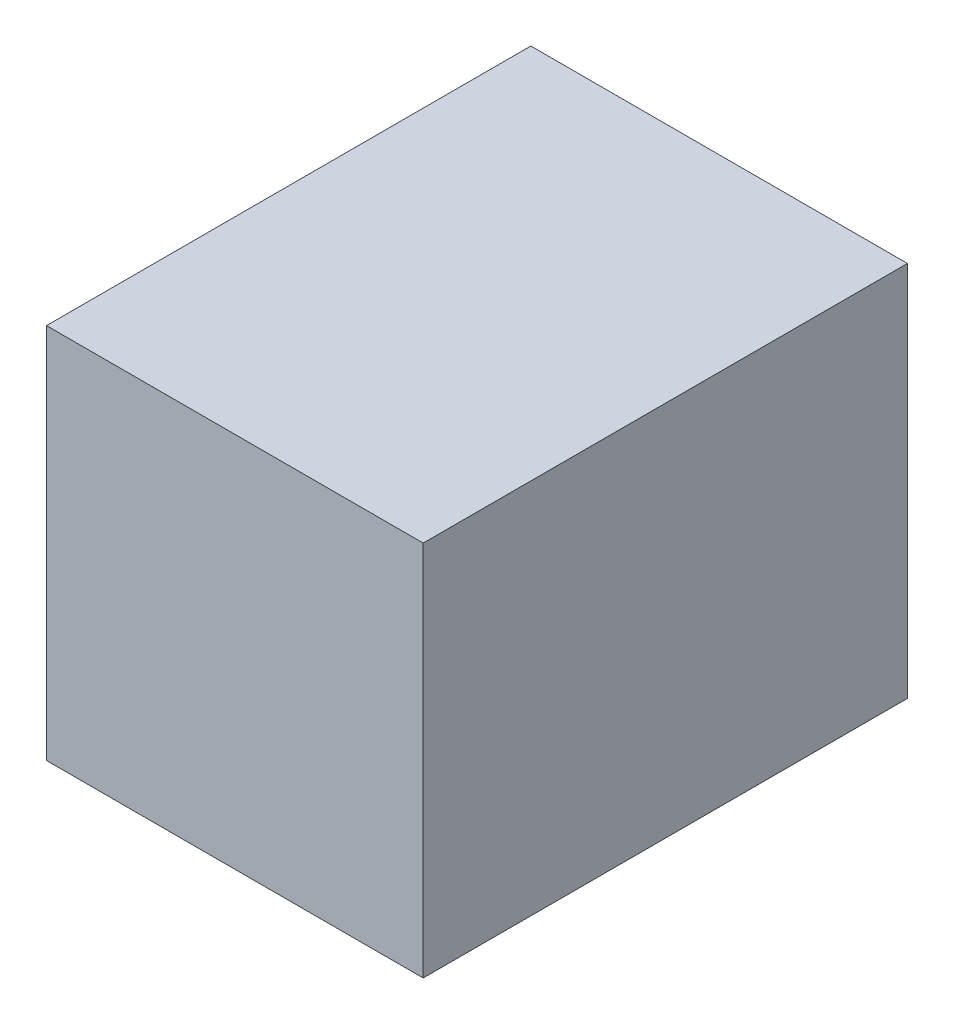
ISO-10303-21;
HEADER;
FILE_DESCRIPTION(('STEP AP214'),'2;1');
FILE_NAME('part.step','',(''),(''),'','','');
FILE_SCHEMA(('AUTOMOTIVE_DESIGN { 1 0 10303 214 1 1 1 1 }'));
ENDSEC;
DATA;
#1=APPLICATION_CONTEXT('core data for automotive mechanical design processes');
#2=APPLICATION_PROTOCOL_DEFINITION('international standard','automotive_design',2000,#1);
#3=PRODUCT_CONTEXT('',#1,'mechanical');
#4=PRODUCT('Part','Part','',(#3));
#5=PRODUCT_RELATED_PRODUCT_CATEGORY('part','',(#4));
#6=PRODUCT_DEFINITION_FORMATION('','',#4);
#7=PRODUCT_DEFINITION_CONTEXT('part definition',#1,'design');
#8=PRODUCT_DEFINITION('design','',#6,#7);
#9=PRODUCT_DEFINITION_SHAPE('','',#8);
#10=(LENGTH_UNIT() NAMED_UNIT(*) SI_UNIT(.MILLI.,.METRE.));
#11=(NAMED_UNIT(*) PLANE_ANGLE_UNIT() SI_UNIT($,.RADIAN.));
#12=(NAMED_UNIT(*) SI_UNIT($,.STERADIAN.) SOLID_ANGLE_UNIT());
#13=UNCERTAINTY_MEASURE_WITH_UNIT(LENGTH_MEASURE(1.E-05),#10,'distance_accuracy_value','');
#14=(GEOMETRIC_REPRESENTATION_CONTEXT(3) GLOBAL_UNCERTAINTY_ASSIGNED_CONTEXT((#13)) GLOBAL_UNIT_ASSIGNED_CONTEXT((#10,
#11,#12)) REPRESENTATION_CONTEXT('',''));
#15=CARTESIAN_POINT('',(0.,0.,0.));
#16=DIRECTION('',(0.,0.,1.));
#17=DIRECTION('',(1.,0.,0.));
#18=AXIS2_PLACEMENT_3D('',#15,#16,#17);
#19=CARTESIAN_POINT('',(0.,0.,450.));
#20=DIRECTION('',(1.,0.,0.));
#21=DIRECTION('',(0.,0.,-1.));
#22=AXIS2_PLACEMENT_3D('',#19,#20,#21);
#23=PLANE('',#22);
#24=DIRECTION('',(0.,-1.,0.));
#25=VECTOR('',#24,1.);
#26=CARTESIAN_POINT('',(0.,0.,0.));
#27=LINE('',#26,#25);
#28=CARTESIAN_POINT('',(0.,350.,0.));
#29=VERTEX_POINT('',#28);
#30=CARTESIAN_POINT('',(0.,0.,0.));
#31=VERTEX_POINT('',#30);
#32=EDGE_CURVE('E96',#29,#31,#27,.T.);
#33=ORIENTED_EDGE('',*,*,#32,.T.);
#34=DIRECTION('',(0.,0.,-1.));
#35=VECTOR('',#34,1.);
#36=CARTESIAN_POINT('',(0.,0.,450.));
#37=LINE('',#36,#35);
#38=CARTESIAN_POINT('',(0.,0.,450.));
#39=VERTEX_POINT('',#38);
#40=EDGE_CURVE('E11',#39,#31,#37,.T.);
#41=ORIENTED_EDGE('',*,*,#40,.F.);
#42=DIRECTION('',(0.,-1.,0.));
#43=VECTOR('',#42,1.);
#44=CARTESIAN_POINT('',(0.,0.,450.));
#45=LINE('',#44,#43);
#46=CARTESIAN_POINT('',(0.,350.,450.));
#47=VERTEX_POINT('',#46);
#48=EDGE_CURVE('E84',#47,#39,#45,.T.);
#49=ORIENTED_EDGE('',*,*,#48,.F.);
#50=DIRECTION('',(0.,0.,-1.));
#51=VECTOR('',#50,1.);
#52=CARTESIAN_POINT('',(0.,350.,450.));
#53=LINE('',#52,#51);
#54=EDGE_CURVE('E92',#47,#29,#53,.T.);
#55=ORIENTED_EDGE('',*,*,#54,.T.);
#56=EDGE_LOOP('',(#33,#41,#49,#55));
#57=FACE_BOUND('',#56,.T.);
#58=ADVANCED_FACE('F33',(#57),#23,.F.);
#59=CARTESIAN_POINT('',(0.,0.,450.));
#60=DIRECTION('',(0.,1.,0.));
#61=DIRECTION('',(0.,0.,1.));
#62=AXIS2_PLACEMENT_3D('',#59,#60,#61);
#63=PLANE('',#62);
#64=DIRECTION('',(1.,0.,0.));
#65=VECTOR('',#64,1.);
#66=CARTESIAN_POINT('',(0.,0.,0.));
#67=LINE('',#66,#65);
#68=CARTESIAN_POINT('',(350.,0.,0.));
#69=VERTEX_POINT('',#68);
#70=EDGE_CURVE('E88',#31,#69,#67,.T.);
#71=ORIENTED_EDGE('',*,*,#70,.T.);
#72=DIRECTION('',(0.,0.,-1.));
#73=VECTOR('',#72,1.);
#74=CARTESIAN_POINT('',(350.,0.,450.));
#75=LINE('',#74,#73);
#76=CARTESIAN_POINT('',(350.,0.,450.));
#77=VERTEX_POINT('',#76);
#78=EDGE_CURVE('E41',#77,#69,#75,.T.);
#79=ORIENTED_EDGE('',*,*,#78,.F.);
#80=DIRECTION('',(1.,0.,0.));
#81=VECTOR('',#80,1.);
#82=CARTESIAN_POINT('',(0.,0.,450.));
#83=LINE('',#82,#81);
#84=EDGE_CURVE('E79',#39,#77,#83,.T.);
#85=ORIENTED_EDGE('',*,*,#84,.F.);
#86=ORIENTED_EDGE('',*,*,#40,.T.);
#87=EDGE_LOOP('',(#71,#79,#85,#86));
#88=FACE_BOUND('',#87,.T.);
#89=ADVANCED_FACE('F87',(#88),#63,.F.);
#90=CARTESIAN_POINT('',(350.,0.,450.));
#91=DIRECTION('',(-1.,0.,0.));
#92=DIRECTION('',(0.,0.,1.));
#93=AXIS2_PLACEMENT_3D('',#90,#91,#92);
#94=PLANE('',#93);
#95=DIRECTION('',(0.,1.,0.));
#96=VECTOR('',#95,1.);
#97=CARTESIAN_POINT('',(350.,0.,0.));
#98=LINE('',#97,#96);
#99=CARTESIAN_POINT('',(350.,350.,0.));
#100=VERTEX_POINT('',#99);
#101=EDGE_CURVE('E66',#69,#100,#98,.T.);
#102=ORIENTED_EDGE('',*,*,#101,.T.);
#103=DIRECTION('',(0.,0.,-1.));
#104=VECTOR('',#103,1.);
#105=CARTESIAN_POINT('',(350.,350.,450.));
#106=LINE('',#105,#104);
#107=CARTESIAN_POINT('',(350.,350.,450.));
#108=VERTEX_POINT('',#107);
#109=EDGE_CURVE('E89',#108,#100,#106,.T.);
#110=ORIENTED_EDGE('',*,*,#109,.F.);
#111=DIRECTION('',(0.,1.,0.));
#112=VECTOR('',#111,1.);
#113=CARTESIAN_POINT('',(350.,0.,450.));
#114=LINE('',#113,#112);
#115=EDGE_CURVE('E82',#77,#108,#114,.T.);
#116=ORIENTED_EDGE('',*,*,#115,.F.);
#117=ORIENTED_EDGE('',*,*,#78,.T.);
#118=EDGE_LOOP('',(#102,#110,#116,#117));
#119=FACE_BOUND('',#118,.T.);
#120=ADVANCED_FACE('F90',(#119),#94,.F.);
#121=CARTESIAN_POINT('',(0.,350.,450.));
#122=DIRECTION('',(0.,-1.,0.));
#123=DIRECTION('',(0.,0.,-1.));
#124=AXIS2_PLACEMENT_3D('',#121,#122,#123);
#125=PLANE('',#124);
#126=DIRECTION('',(-1.,0.,0.));
#127=VECTOR('',#126,1.);
#128=CARTESIAN_POINT('',(0.,350.,0.));
#129=LINE('',#128,#127);
#130=EDGE_CURVE('E72',#100,#29,#129,.T.);
#131=ORIENTED_EDGE('',*,*,#130,.T.);
#132=ORIENTED_EDGE('',*,*,#54,.F.);
#133=DIRECTION('',(-1.,0.,0.));
#134=VECTOR('',#133,1.);
#135=CARTESIAN_POINT('',(0.,350.,450.));
#136=LINE('',#135,#134);
#137=EDGE_CURVE('E49',#108,#47,#136,.T.);
#138=ORIENTED_EDGE('',*,*,#137,.F.);
#139=ORIENTED_EDGE('',*,*,#109,.T.);
#140=EDGE_LOOP('',(#131,#132,#138,#139));
#141=FACE_BOUND('',#140,.T.);
#142=ADVANCED_FACE('F103',(#141),#125,.F.);
#143=CARTESIAN_POINT('',(0.,0.,450.));
#144=DIRECTION('',(0.,0.,-1.));
#145=DIRECTION('',(-1.,0.,0.));
#146=AXIS2_PLACEMENT_3D('',#143,#144,#145);
#147=PLANE('',#146);
#148=ORIENTED_EDGE('',*,*,#48,.T.);
#149=ORIENTED_EDGE('',*,*,#84,.T.);
#150=ORIENTED_EDGE('',*,*,#115,.T.);
#151=ORIENTED_EDGE('',*,*,#137,.T.);
#152=EDGE_LOOP('',(#148,#149,#150,#151));
#153=FACE_BOUND('',#152,.T.);
#154=ADVANCED_FACE('F80',(#153),#147,.F.);
#155=CARTESIAN_POINT('',(0.,0.,0.));
#156=DIRECTION('',(0.,0.,-1.));
#157=DIRECTION('',(-1.,0.,0.));
#158=AXIS2_PLACEMENT_3D('',#155,#156,#157);
#159=PLANE('',#158);
#160=ORIENTED_EDGE('',*,*,#32,.F.);
#161=ORIENTED_EDGE('',*,*,#130,.F.);
#162=ORIENTED_EDGE('',*,*,#101,.F.);
#163=ORIENTED_EDGE('',*,*,#70,.F.);
#164=EDGE_LOOP('',(#160,#161,#162,#163));
#165=FACE_BOUND('',#164,.T.);
#166=ADVANCED_FACE('F106',(#165),#159,.T.);
#167=CLOSED_SHELL('',(#58,#89,#120,#142,#154,#166));
#168=MANIFOLD_SOLID_BREP('B2',#167);
#169=ADVANCED_BREP_SHAPE_REPRESENTATION('',(#18,#168),#14);
#170=SHAPE_DEFINITION_REPRESENTATION(#9,#169);
ENDSEC;
END-ISO-10303-21;
